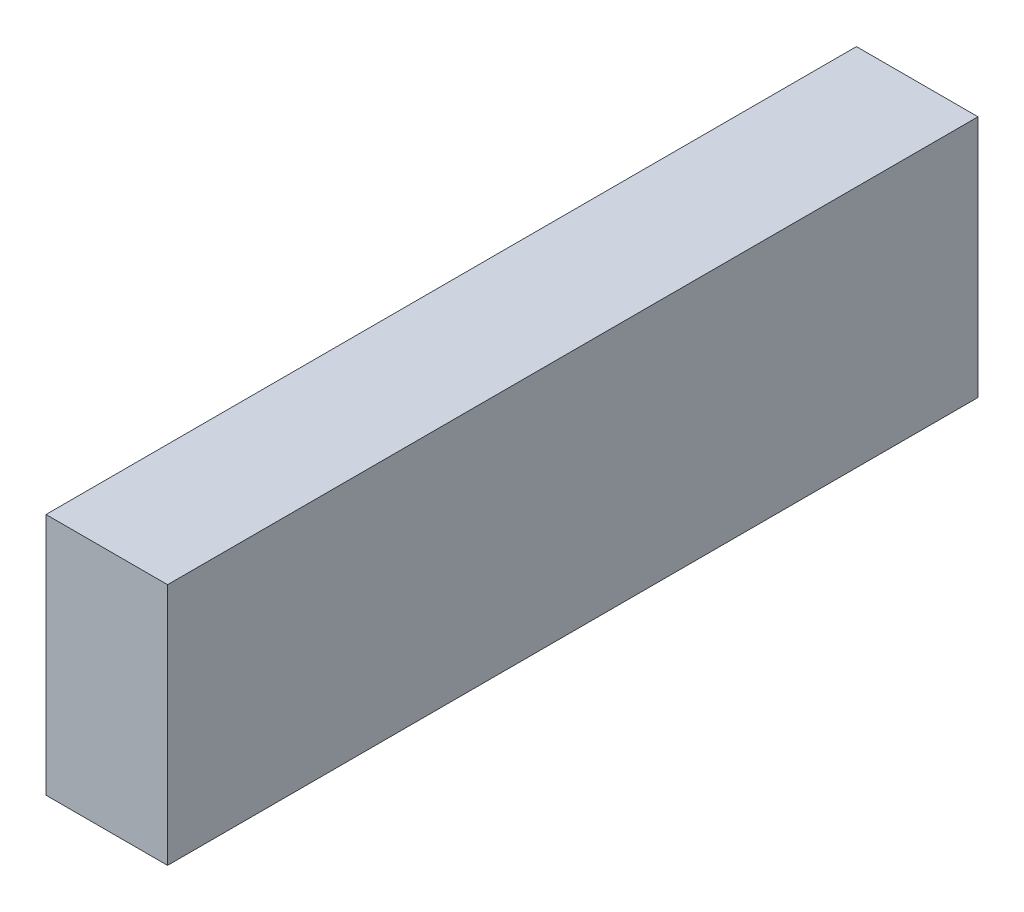
ISO-10303-21;
HEADER;
FILE_DESCRIPTION(('STEP AP214'),'2;1');
FILE_NAME('part.step','',(''),(''),'','','');
FILE_SCHEMA(('AUTOMOTIVE_DESIGN { 1 0 10303 214 1 1 1 1 }'));
ENDSEC;
DATA;
#1=APPLICATION_CONTEXT('core data for automotive mechanical design processes');
#2=APPLICATION_PROTOCOL_DEFINITION('international standard','automotive_design',2000,#1);
#3=PRODUCT_CONTEXT('',#1,'mechanical');
#4=PRODUCT('Part','Part','',(#3));
#5=PRODUCT_RELATED_PRODUCT_CATEGORY('part','',(#4));
#6=PRODUCT_DEFINITION_FORMATION('','',#4);
#7=PRODUCT_DEFINITION_CONTEXT('part definition',#1,'design');
#8=PRODUCT_DEFINITION('design','',#6,#7);
#9=PRODUCT_DEFINITION_SHAPE('','',#8);
#10=(LENGTH_UNIT() NAMED_UNIT(*) SI_UNIT(.MILLI.,.METRE.));
#11=(NAMED_UNIT(*) PLANE_ANGLE_UNIT() SI_UNIT($,.RADIAN.));
#12=(NAMED_UNIT(*) SI_UNIT($,.STERADIAN.) SOLID_ANGLE_UNIT());
#13=UNCERTAINTY_MEASURE_WITH_UNIT(LENGTH_MEASURE(1.E-05),#10,'distance_accuracy_value','');
#14=(GEOMETRIC_REPRESENTATION_CONTEXT(3) GLOBAL_UNCERTAINTY_ASSIGNED_CONTEXT((#13)) GLOBAL_UNIT_ASSIGNED_CONTEXT((#10,
#11,#12)) REPRESENTATION_CONTEXT('',''));
#15=CARTESIAN_POINT('',(0.,0.,0.));
#16=DIRECTION('',(0.,0.,1.));
#17=DIRECTION('',(1.,0.,0.));
#18=AXIS2_PLACEMENT_3D('',#15,#16,#17);
#19=CARTESIAN_POINT('',(1.5,3.,20.));
#20=DIRECTION('',(-1.,0.,0.));
#21=DIRECTION('',(0.,0.,1.));
#22=AXIS2_PLACEMENT_3D('',#19,#20,#21);
#23=PLANE('',#22);
#24=DIRECTION('',(0.,1.,0.));
#25=VECTOR('',#24,1.);
#26=CARTESIAN_POINT('',(1.5,3.,0.));
#27=LINE('',#26,#25);
#28=CARTESIAN_POINT('',(1.5,-3.,0.));
#29=VERTEX_POINT('',#28);
#30=CARTESIAN_POINT('',(1.5,3.,0.));
#31=VERTEX_POINT('',#30);
#32=EDGE_CURVE('E111',#29,#31,#27,.T.);
#33=ORIENTED_EDGE('',*,*,#32,.T.);
#34=DIRECTION('',(0.,0.,-1.));
#35=VECTOR('',#34,1.);
#36=CARTESIAN_POINT('',(1.5,3.,20.));
#37=LINE('',#36,#35);
#38=CARTESIAN_POINT('',(1.5,3.,20.));
#39=VERTEX_POINT('',#38);
#40=EDGE_CURVE('E11',#39,#31,#37,.T.);
#41=ORIENTED_EDGE('',*,*,#40,.F.);
#42=DIRECTION('',(0.,1.,0.));
#43=VECTOR('',#42,1.);
#44=CARTESIAN_POINT('',(1.5,3.,20.));
#45=LINE('',#44,#43);
#46=CARTESIAN_POINT('',(1.5,-3.,20.));
#47=VERTEX_POINT('',#46);
#48=EDGE_CURVE('E95',#47,#39,#45,.T.);
#49=ORIENTED_EDGE('',*,*,#48,.F.);
#50=DIRECTION('',(0.,0.,-1.));
#51=VECTOR('',#50,1.);
#52=CARTESIAN_POINT('',(1.5,-3.,20.));
#53=LINE('',#52,#51);
#54=EDGE_CURVE('E107',#47,#29,#53,.T.);
#55=ORIENTED_EDGE('',*,*,#54,.T.);
#56=EDGE_LOOP('',(#33,#41,#49,#55));
#57=FACE_BOUND('',#56,.T.);
#58=ADVANCED_FACE('F43',(#57),#23,.F.);
#59=CARTESIAN_POINT('',(-1.5,3.,20.));
#60=DIRECTION('',(0.,-1.,0.));
#61=DIRECTION('',(0.,0.,-1.));
#62=AXIS2_PLACEMENT_3D('',#59,#60,#61);
#63=PLANE('',#62);
#64=DIRECTION('',(-1.,0.,0.));
#65=VECTOR('',#64,1.);
#66=CARTESIAN_POINT('',(-1.5,3.,0.));
#67=LINE('',#66,#65);
#68=CARTESIAN_POINT('',(-1.5,3.,0.));
#69=VERTEX_POINT('',#68);
#70=EDGE_CURVE('E100',#31,#69,#67,.T.);
#71=ORIENTED_EDGE('',*,*,#70,.T.);
#72=DIRECTION('',(0.,0.,-1.));
#73=VECTOR('',#72,1.);
#74=CARTESIAN_POINT('',(-1.5,3.,20.));
#75=LINE('',#74,#73);
#76=CARTESIAN_POINT('',(-1.5,3.,20.));
#77=VERTEX_POINT('',#76);
#78=EDGE_CURVE('E52',#77,#69,#75,.T.);
#79=ORIENTED_EDGE('',*,*,#78,.F.);
#80=DIRECTION('',(-1.,0.,0.));
#81=VECTOR('',#80,1.);
#82=CARTESIAN_POINT('',(-1.5,3.,20.));
#83=LINE('',#82,#81);
#84=EDGE_CURVE('E90',#39,#77,#83,.T.);
#85=ORIENTED_EDGE('',*,*,#84,.F.);
#86=ORIENTED_EDGE('',*,*,#40,.T.);
#87=EDGE_LOOP('',(#71,#79,#85,#86));
#88=FACE_BOUND('',#87,.T.);
#89=ADVANCED_FACE('F99',(#88),#63,.F.);
#90=CARTESIAN_POINT('',(-1.5,3.,20.));
#91=DIRECTION('',(1.,0.,0.));
#92=DIRECTION('',(0.,0.,-1.));
#93=AXIS2_PLACEMENT_3D('',#90,#91,#92);
#94=PLANE('',#93);
#95=DIRECTION('',(0.,-1.,0.));
#96=VECTOR('',#95,1.);
#97=CARTESIAN_POINT('',(-1.5,3.,0.));
#98=LINE('',#97,#96);
#99=CARTESIAN_POINT('',(-1.5,-3.,0.));
#100=VERTEX_POINT('',#99);
#101=EDGE_CURVE('E77',#69,#100,#98,.T.);
#102=ORIENTED_EDGE('',*,*,#101,.T.);
#103=DIRECTION('',(0.,0.,-1.));
#104=VECTOR('',#103,1.);
#105=CARTESIAN_POINT('',(-1.5,-3.,20.));
#106=LINE('',#105,#104);
#107=CARTESIAN_POINT('',(-1.5,-3.,20.));
#108=VERTEX_POINT('',#107);
#109=EDGE_CURVE('E102',#108,#100,#106,.T.);
#110=ORIENTED_EDGE('',*,*,#109,.F.);
#111=DIRECTION('',(0.,-1.,0.));
#112=VECTOR('',#111,1.);
#113=CARTESIAN_POINT('',(-1.5,3.,20.));
#114=LINE('',#113,#112);
#115=EDGE_CURVE('E93',#77,#108,#114,.T.);
#116=ORIENTED_EDGE('',*,*,#115,.F.);
#117=ORIENTED_EDGE('',*,*,#78,.T.);
#118=EDGE_LOOP('',(#102,#110,#116,#117));
#119=FACE_BOUND('',#118,.T.);
#120=ADVANCED_FACE('F103',(#119),#94,.F.);
#121=CARTESIAN_POINT('',(-1.5,-3.,20.));
#122=DIRECTION('',(0.,1.,0.));
#123=DIRECTION('',(0.,0.,1.));
#124=AXIS2_PLACEMENT_3D('',#121,#122,#123);
#125=PLANE('',#124);
#126=DIRECTION('',(1.,0.,0.));
#127=VECTOR('',#126,1.);
#128=CARTESIAN_POINT('',(-1.5,-3.,0.));
#129=LINE('',#128,#127);
#130=EDGE_CURVE('E83',#100,#29,#129,.T.);
#131=ORIENTED_EDGE('',*,*,#130,.T.);
#132=ORIENTED_EDGE('',*,*,#54,.F.);
#133=DIRECTION('',(1.,0.,0.));
#134=VECTOR('',#133,1.);
#135=CARTESIAN_POINT('',(-1.5,-3.,20.));
#136=LINE('',#135,#134);
#137=EDGE_CURVE('E60',#108,#47,#136,.T.);
#138=ORIENTED_EDGE('',*,*,#137,.F.);
#139=ORIENTED_EDGE('',*,*,#109,.T.);
#140=EDGE_LOOP('',(#131,#132,#138,#139));
#141=FACE_BOUND('',#140,.T.);
#142=ADVANCED_FACE('F124',(#141),#125,.F.);
#143=CARTESIAN_POINT('',(0.,0.,20.));
#144=DIRECTION('',(0.,0.,1.));
#145=DIRECTION('',(1.,0.,0.));
#146=AXIS2_PLACEMENT_3D('',#143,#144,#145);
#147=PLANE('',#146);
#148=ORIENTED_EDGE('',*,*,#48,.T.);
#149=ORIENTED_EDGE('',*,*,#84,.T.);
#150=ORIENTED_EDGE('',*,*,#115,.T.);
#151=ORIENTED_EDGE('',*,*,#137,.T.);
#152=EDGE_LOOP('',(#148,#149,#150,#151));
#153=FACE_BOUND('',#152,.T.);
#154=ADVANCED_FACE('F91',(#153),#147,.T.);
#155=CARTESIAN_POINT('',(0.,0.,0.));
#156=DIRECTION('',(0.,0.,1.));
#157=DIRECTION('',(1.,0.,0.));
#158=AXIS2_PLACEMENT_3D('',#155,#156,#157);
#159=PLANE('',#158);
#160=ORIENTED_EDGE('',*,*,#32,.F.);
#161=ORIENTED_EDGE('',*,*,#130,.F.);
#162=ORIENTED_EDGE('',*,*,#101,.F.);
#163=ORIENTED_EDGE('',*,*,#70,.F.);
#164=EDGE_LOOP('',(#160,#161,#162,#163));
#165=FACE_BOUND('',#164,.T.);
#166=ADVANCED_FACE('F127',(#165),#159,.F.);
#167=CLOSED_SHELL('',(#58,#89,#120,#142,#154,#166));
#168=MANIFOLD_SOLID_BREP('B2',#167);
#169=ADVANCED_BREP_SHAPE_REPRESENTATION('',(#18,#168),#14);
#170=SHAPE_DEFINITION_REPRESENTATION(#9,#169);
ENDSEC;
END-ISO-10303-21;
